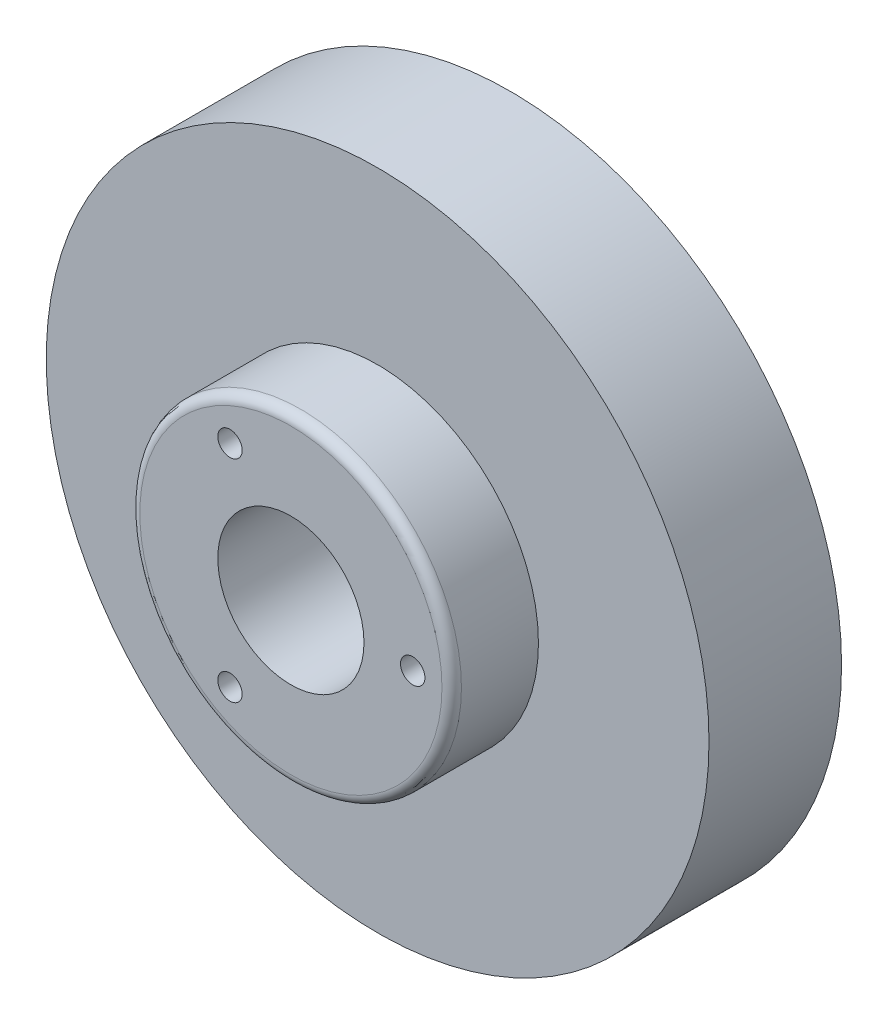
ISO-10303-21;
HEADER;
FILE_DESCRIPTION(('STEP AP214'),'2;1');
FILE_NAME('part.step','',(''),(''),'','','');
FILE_SCHEMA(('AUTOMOTIVE_DESIGN { 1 0 10303 214 1 1 1 1 }'));
ENDSEC;
DATA;
#1=APPLICATION_CONTEXT('core data for automotive mechanical design processes');
#2=APPLICATION_PROTOCOL_DEFINITION('international standard','automotive_design',2000,#1);
#3=PRODUCT_CONTEXT('',#1,'mechanical');
#4=PRODUCT('Part','Part','',(#3));
#5=PRODUCT_RELATED_PRODUCT_CATEGORY('part','',(#4));
#6=PRODUCT_DEFINITION_FORMATION('','',#4);
#7=PRODUCT_DEFINITION_CONTEXT('part definition',#1,'design');
#8=PRODUCT_DEFINITION('design','',#6,#7);
#9=PRODUCT_DEFINITION_SHAPE('','',#8);
#10=(LENGTH_UNIT() NAMED_UNIT(*) SI_UNIT(.MILLI.,.METRE.));
#11=(NAMED_UNIT(*) PLANE_ANGLE_UNIT() SI_UNIT($,.RADIAN.));
#12=(NAMED_UNIT(*) SI_UNIT($,.STERADIAN.) SOLID_ANGLE_UNIT());
#13=UNCERTAINTY_MEASURE_WITH_UNIT(LENGTH_MEASURE(1.E-05),#10,'distance_accuracy_value','');
#14=(GEOMETRIC_REPRESENTATION_CONTEXT(3) GLOBAL_UNCERTAINTY_ASSIGNED_CONTEXT((#13)) GLOBAL_UNIT_ASSIGNED_CONTEXT((#10,
#11,#12)) REPRESENTATION_CONTEXT('',''));
#15=CARTESIAN_POINT('',(0.,0.,0.));
#16=DIRECTION('',(0.,0.,1.));
#17=DIRECTION('',(1.,0.,0.));
#18=AXIS2_PLACEMENT_3D('',#15,#16,#17);
#19=CARTESIAN_POINT('',(0.,0.,13.6));
#20=DIRECTION('',(0.,0.,1.));
#21=DIRECTION('',(1.,0.,0.));
#22=AXIS2_PLACEMENT_3D('',#19,#20,#21);
#23=PLANE('',#22);
#24=CARTESIAN_POINT('',(0.,0.,13.6));
#25=DIRECTION('',(0.,0.,1.));
#26=DIRECTION('',(1.,0.,0.));
#27=AXIS2_PLACEMENT_3D('',#24,#25,#26);
#28=CIRCLE('',#27,34.);
#29=CARTESIAN_POINT('',(34.,0.,13.6));
#30=VERTEX_POINT('',#29);
#31=EDGE_CURVE('E46',#30,#30,#28,.T.);
#32=ORIENTED_EDGE('',*,*,#31,.T.);
#33=EDGE_LOOP('',(#32));
#34=FACE_BOUND('',#33,.T.);
#35=CARTESIAN_POINT('',(0.,0.,13.6));
#36=DIRECTION('',(0.,0.,1.));
#37=DIRECTION('',(1.,0.,0.));
#38=AXIS2_PLACEMENT_3D('',#35,#36,#37);
#39=CIRCLE('',#38,16.5);
#40=CARTESIAN_POINT('',(16.5,0.,13.6));
#41=VERTEX_POINT('',#40);
#42=EDGE_CURVE('E54',#41,#41,#39,.T.);
#43=ORIENTED_EDGE('',*,*,#42,.F.);
#44=EDGE_LOOP('',(#43));
#45=FACE_BOUND('',#44,.T.);
#46=ADVANCED_FACE('F35',(#34,#45),#23,.T.);
#47=CARTESIAN_POINT('',(0.,0.,13.6));
#48=DIRECTION('',(0.,0.,-1.));
#49=DIRECTION('',(-1.,0.,0.));
#50=AXIS2_PLACEMENT_3D('',#47,#48,#49);
#51=CYLINDRICAL_SURFACE('',#50,34.);
#52=ORIENTED_EDGE('',*,*,#31,.F.);
#53=EDGE_LOOP('',(#52));
#54=FACE_BOUND('',#53,.T.);
#55=CARTESIAN_POINT('',(0.,0.,0.));
#56=DIRECTION('',(0.,0.,1.));
#57=DIRECTION('',(1.,0.,0.));
#58=AXIS2_PLACEMENT_3D('',#55,#56,#57);
#59=CIRCLE('',#58,34.);
#60=CARTESIAN_POINT('',(34.,0.,0.));
#61=VERTEX_POINT('',#60);
#62=EDGE_CURVE('E50',#61,#61,#59,.T.);
#63=ORIENTED_EDGE('',*,*,#62,.T.);
#64=EDGE_LOOP('',(#63));
#65=FACE_BOUND('',#64,.T.);
#66=ADVANCED_FACE('F111',(#54,#65),#51,.T.);
#67=CARTESIAN_POINT('',(0.,0.,0.));
#68=DIRECTION('',(0.,0.,1.));
#69=DIRECTION('',(1.,0.,0.));
#70=AXIS2_PLACEMENT_3D('',#67,#68,#69);
#71=PLANE('',#70);
#72=CARTESIAN_POINT('',(-6.24999999999998,10.8253175473055,0.));
#73=DIRECTION('',(0.,0.,1.));
#74=DIRECTION('',(1.,0.,0.));
#75=AXIS2_PLACEMENT_3D('',#72,#73,#74);
#76=CIRCLE('',#75,1.25);
#77=CARTESIAN_POINT('',(-4.99999999999998,10.8253175473055,0.));
#78=VERTEX_POINT('',#77);
#79=EDGE_CURVE('E76',#78,#78,#76,.T.);
#80=ORIENTED_EDGE('',*,*,#79,.T.);
#81=EDGE_LOOP('',(#80));
#82=FACE_BOUND('',#81,.T.);
#83=CARTESIAN_POINT('',(-6.25000000000005,-10.8253175473055,0.));
#84=DIRECTION('',(0.,0.,1.));
#85=DIRECTION('',(1.,0.,0.));
#86=AXIS2_PLACEMENT_3D('',#83,#84,#85);
#87=CIRCLE('',#86,1.25);
#88=CARTESIAN_POINT('',(-5.00000000000006,-10.8253175473055,0.));
#89=VERTEX_POINT('',#88);
#90=EDGE_CURVE('E70',#89,#89,#87,.T.);
#91=ORIENTED_EDGE('',*,*,#90,.T.);
#92=EDGE_LOOP('',(#91));
#93=FACE_BOUND('',#92,.T.);
#94=CARTESIAN_POINT('',(12.5,0.,0.));
#95=DIRECTION('',(0.,0.,1.));
#96=DIRECTION('',(1.,0.,0.));
#97=AXIS2_PLACEMENT_3D('',#94,#95,#96);
#98=CIRCLE('',#97,1.25);
#99=CARTESIAN_POINT('',(13.75,0.,0.));
#100=VERTEX_POINT('',#99);
#101=EDGE_CURVE('E62',#100,#100,#98,.T.);
#102=ORIENTED_EDGE('',*,*,#101,.T.);
#103=EDGE_LOOP('',(#102));
#104=FACE_BOUND('',#103,.T.);
#105=CARTESIAN_POINT('',(0.,0.,0.));
#106=DIRECTION('',(0.,0.,1.));
#107=DIRECTION('',(1.,0.,0.));
#108=AXIS2_PLACEMENT_3D('',#105,#106,#107);
#109=CIRCLE('',#108,7.5);
#110=CARTESIAN_POINT('',(7.5,0.,0.));
#111=VERTEX_POINT('',#110);
#112=EDGE_CURVE('E58',#111,#111,#109,.T.);
#113=ORIENTED_EDGE('',*,*,#112,.T.);
#114=EDGE_LOOP('',(#113));
#115=FACE_BOUND('',#114,.T.);
#116=ORIENTED_EDGE('',*,*,#62,.F.);
#117=EDGE_LOOP('',(#116));
#118=FACE_BOUND('',#117,.T.);
#119=ADVANCED_FACE('F117',(#82,#93,#104,#115,#118),#71,.F.);
#120=CARTESIAN_POINT('',(0.,0.,22.5));
#121=DIRECTION('',(0.,0.,-1.));
#122=DIRECTION('',(-1.,0.,0.));
#123=AXIS2_PLACEMENT_3D('',#120,#121,#122);
#124=CYLINDRICAL_SURFACE('',#123,16.5);
#125=CARTESIAN_POINT('',(0.,0.,21.5));
#126=DIRECTION('',(0.,0.,1.));
#127=DIRECTION('',(1.,0.,0.));
#128=AXIS2_PLACEMENT_3D('',#125,#126,#127);
#129=CIRCLE('',#128,16.5);
#130=CARTESIAN_POINT('',(16.5,0.,21.5));
#131=VERTEX_POINT('',#130);
#132=EDGE_CURVE('E10',#131,#131,#129,.F.);
#133=ORIENTED_EDGE('',*,*,#132,.T.);
#134=EDGE_LOOP('',(#133));
#135=FACE_BOUND('',#134,.T.);
#136=ORIENTED_EDGE('',*,*,#42,.T.);
#137=EDGE_LOOP('',(#136));
#138=FACE_BOUND('',#137,.T.);
#139=ADVANCED_FACE('F88',(#135,#138),#124,.T.);
#140=CARTESIAN_POINT('',(0.,0.,22.5));
#141=DIRECTION('',(0.,0.,1.));
#142=DIRECTION('',(1.,0.,0.));
#143=AXIS2_PLACEMENT_3D('',#140,#141,#142);
#144=PLANE('',#143);
#145=CARTESIAN_POINT('',(-6.24999999999998,10.8253175473055,22.5));
#146=DIRECTION('',(0.,0.,1.));
#147=DIRECTION('',(1.,0.,0.));
#148=AXIS2_PLACEMENT_3D('',#145,#146,#147);
#149=CIRCLE('',#148,1.24999999999999);
#150=CARTESIAN_POINT('',(-4.99999999999999,10.8253175473055,22.5));
#151=VERTEX_POINT('',#150);
#152=EDGE_CURVE('E79',#151,#151,#149,.T.);
#153=ORIENTED_EDGE('',*,*,#152,.F.);
#154=EDGE_LOOP('',(#153));
#155=FACE_BOUND('',#154,.T.);
#156=CARTESIAN_POINT('',(-6.25000000000005,-10.8253175473055,22.5));
#157=DIRECTION('',(0.,0.,1.));
#158=DIRECTION('',(1.,0.,0.));
#159=AXIS2_PLACEMENT_3D('',#156,#157,#158);
#160=CIRCLE('',#159,1.24999999999999);
#161=CARTESIAN_POINT('',(-5.00000000000007,-10.8253175473055,22.5));
#162=VERTEX_POINT('',#161);
#163=EDGE_CURVE('E73',#162,#162,#160,.T.);
#164=ORIENTED_EDGE('',*,*,#163,.F.);
#165=EDGE_LOOP('',(#164));
#166=FACE_BOUND('',#165,.T.);
#167=CARTESIAN_POINT('',(12.5,0.,22.5));
#168=DIRECTION('',(0.,0.,1.));
#169=DIRECTION('',(1.,0.,0.));
#170=AXIS2_PLACEMENT_3D('',#167,#168,#169);
#171=CIRCLE('',#170,1.24999999999999);
#172=CARTESIAN_POINT('',(13.75,0.,22.5));
#173=VERTEX_POINT('',#172);
#174=EDGE_CURVE('E67',#173,#173,#171,.T.);
#175=ORIENTED_EDGE('',*,*,#174,.F.);
#176=EDGE_LOOP('',(#175));
#177=FACE_BOUND('',#176,.T.);
#178=CARTESIAN_POINT('',(0.,0.,22.5));
#179=DIRECTION('',(0.,0.,1.));
#180=DIRECTION('',(1.,0.,0.));
#181=AXIS2_PLACEMENT_3D('',#178,#179,#180);
#182=CIRCLE('',#181,7.5);
#183=CARTESIAN_POINT('',(7.5,0.,22.5));
#184=VERTEX_POINT('',#183);
#185=EDGE_CURVE('E59',#184,#184,#182,.T.);
#186=ORIENTED_EDGE('',*,*,#185,.F.);
#187=EDGE_LOOP('',(#186));
#188=FACE_BOUND('',#187,.T.);
#189=CARTESIAN_POINT('',(0.,0.,22.5));
#190=DIRECTION('',(0.,0.,1.));
#191=DIRECTION('',(1.,0.,0.));
#192=AXIS2_PLACEMENT_3D('',#189,#190,#191);
#193=CIRCLE('',#192,15.5);
#194=CARTESIAN_POINT('',(15.5,0.,22.5));
#195=VERTEX_POINT('',#194);
#196=EDGE_CURVE('E42',#195,#195,#193,.T.);
#197=ORIENTED_EDGE('',*,*,#196,.T.);
#198=EDGE_LOOP('',(#197));
#199=FACE_BOUND('',#198,.T.);
#200=ADVANCED_FACE('F85',(#155,#166,#177,#188,#199),#144,.T.);
#201=CARTESIAN_POINT('',(0.,0.,21.5));
#202=DIRECTION('',(0.,0.,1.));
#203=DIRECTION('',(1.,0.,0.));
#204=AXIS2_PLACEMENT_3D('',#201,#202,#203);
#205=TOROIDAL_SURFACE('',#204,15.5,1.);
#206=ORIENTED_EDGE('',*,*,#132,.F.);
#207=EDGE_LOOP('',(#206));
#208=FACE_BOUND('',#207,.T.);
#209=ORIENTED_EDGE('',*,*,#196,.F.);
#210=EDGE_LOOP('',(#209));
#211=FACE_BOUND('',#210,.T.);
#212=ADVANCED_FACE('F37',(#208,#211),#205,.T.);
#213=CARTESIAN_POINT('',(0.,0.,0.));
#214=DIRECTION('',(0.,0.,1.));
#215=DIRECTION('',(1.,0.,0.));
#216=AXIS2_PLACEMENT_3D('',#213,#214,#215);
#217=CYLINDRICAL_SURFACE('',#216,7.5);
#218=CARTESIAN_POINT('',(7.5,0.,0.));
#219=CARTESIAN_POINT('',(7.5,0.,0.234374999999999));
#220=CARTESIAN_POINT('',(7.5,0.,0.46875));
#221=CARTESIAN_POINT('',(7.5,0.,0.9375));
#222=CARTESIAN_POINT('',(7.5,0.,1.171875));
#223=CARTESIAN_POINT('',(7.5,0.,1.640625));
#224=CARTESIAN_POINT('',(7.5,0.,1.875));
#225=CARTESIAN_POINT('',(7.5,0.,2.34375));
#226=CARTESIAN_POINT('',(7.5,0.,2.578125));
#227=CARTESIAN_POINT('',(7.5,0.,3.046875));
#228=CARTESIAN_POINT('',(7.5,0.,3.28125));
#229=CARTESIAN_POINT('',(7.5,0.,3.75));
#230=CARTESIAN_POINT('',(7.5,0.,3.984375));
#231=CARTESIAN_POINT('',(7.5,0.,4.453125));
#232=CARTESIAN_POINT('',(7.5,0.,4.6875));
#233=CARTESIAN_POINT('',(7.5,0.,5.15625));
#234=CARTESIAN_POINT('',(7.5,0.,5.390625));
#235=CARTESIAN_POINT('',(7.5,0.,5.859375));
#236=CARTESIAN_POINT('',(7.5,0.,6.09375));
#237=CARTESIAN_POINT('',(7.5,0.,6.5625));
#238=CARTESIAN_POINT('',(7.5,0.,6.796875));
#239=CARTESIAN_POINT('',(7.5,0.,7.265625));
#240=CARTESIAN_POINT('',(7.5,0.,7.5));
#241=CARTESIAN_POINT('',(7.5,0.,7.96875));
#242=CARTESIAN_POINT('',(7.5,0.,8.203125));
#243=CARTESIAN_POINT('',(7.5,0.,8.671875));
#244=CARTESIAN_POINT('',(7.5,0.,8.90625));
#245=CARTESIAN_POINT('',(7.5,0.,9.375));
#246=CARTESIAN_POINT('',(7.5,0.,9.609375));
#247=CARTESIAN_POINT('',(7.5,0.,10.078125));
#248=CARTESIAN_POINT('',(7.5,0.,10.3125));
#249=CARTESIAN_POINT('',(7.5,0.,10.78125));
#250=CARTESIAN_POINT('',(7.5,0.,11.015625));
#251=CARTESIAN_POINT('',(7.5,0.,11.484375));
#252=CARTESIAN_POINT('',(7.5,0.,11.71875));
#253=CARTESIAN_POINT('',(7.5,0.,12.1875));
#254=CARTESIAN_POINT('',(7.5,0.,12.421875));
#255=CARTESIAN_POINT('',(7.5,0.,12.890625));
#256=CARTESIAN_POINT('',(7.5,0.,13.125));
#257=CARTESIAN_POINT('',(7.5,0.,13.59375));
#258=CARTESIAN_POINT('',(7.5,0.,13.828125));
#259=CARTESIAN_POINT('',(7.5,0.,14.296875));
#260=CARTESIAN_POINT('',(7.5,0.,14.53125));
#261=CARTESIAN_POINT('',(7.5,0.,15.));
#262=CARTESIAN_POINT('',(7.5,0.,15.234375));
#263=CARTESIAN_POINT('',(7.5,0.,15.703125));
#264=CARTESIAN_POINT('',(7.5,0.,15.9375));
#265=CARTESIAN_POINT('',(7.5,0.,16.40625));
#266=CARTESIAN_POINT('',(7.5,0.,16.640625));
#267=CARTESIAN_POINT('',(7.5,0.,17.109375));
#268=CARTESIAN_POINT('',(7.5,0.,17.34375));
#269=CARTESIAN_POINT('',(7.5,0.,17.8125));
#270=CARTESIAN_POINT('',(7.5,0.,18.046875));
#271=CARTESIAN_POINT('',(7.5,0.,18.515625));
#272=CARTESIAN_POINT('',(7.5,0.,18.75));
#273=CARTESIAN_POINT('',(7.5,0.,19.21875));
#274=CARTESIAN_POINT('',(7.5,0.,19.453125));
#275=CARTESIAN_POINT('',(7.5,0.,19.921875));
#276=CARTESIAN_POINT('',(7.5,0.,20.15625));
#277=CARTESIAN_POINT('',(7.5,0.,20.625));
#278=CARTESIAN_POINT('',(7.5,0.,20.859375));
#279=CARTESIAN_POINT('',(7.5,0.,21.328125));
#280=CARTESIAN_POINT('',(7.5,0.,21.5625));
#281=CARTESIAN_POINT('',(7.5,0.,22.03125));
#282=CARTESIAN_POINT('',(7.5,0.,22.265625));
#283=CARTESIAN_POINT('',(7.5,0.,22.5));
#284=B_SPLINE_CURVE_WITH_KNOTS('',3,(#218,#219,#220,#221,#222,#223,#224,#225,#226,#227,#228,
#229,#230,#231,#232,#233,#234,#235,#236,#237,#238,#239,#240,#241,#242,#243,#244,#245,#246,#247,
#248,#249,#250,#251,#252,#253,#254,#255,#256,#257,#258,#259,#260,#261,#262,#263,#264,#265,#266,
#267,#268,#269,#270,#271,#272,#273,#274,#275,#276,#277,#278,#279,#280,#281,#282,#283),
.UNSPECIFIED.,.F.,.F.,(4,2,2,2,2,2,2,2,2,2,2,2,2,2,2,2,2,2,2,2,2,2,2,2,2,2,2,2,2,2,2,2,4),(0.,
0.703125,1.40625,2.109375,2.8125,3.515625,4.21875,4.921875,5.625,6.328125,7.03125,7.734375,
8.4375,9.140625,9.84375,10.546875,11.25,11.953125,12.65625,13.359375,14.0625,14.765625,15.46875,
16.171875,16.875,17.578125,18.28125,18.984375,19.6875,20.390625,21.09375,21.796875,22.5),.UNSPECIFIED.);
#285=EDGE_CURVE('BSEAM96',#111,#184,#284,.T.);
#286=ORIENTED_EDGE('',*,*,#112,.F.);
#287=ORIENTED_EDGE('',*,*,#185,.T.);
#288=ORIENTED_EDGE('',*,*,#285,.T.);
#289=ORIENTED_EDGE('',*,*,#285,.F.);
#290=EDGE_LOOP('',(#286,#288,#287,#289));
#291=FACE_BOUND('',#290,.T.);
#292=ADVANCED_FACE('F96',(#291),#217,.F.);
#293=CARTESIAN_POINT('',(12.5,0.,22.5));
#294=DIRECTION('',(0.,0.,1.));
#295=DIRECTION('',(1.,0.,0.));
#296=AXIS2_PLACEMENT_3D('',#293,#294,#295);
#297=CYLINDRICAL_SURFACE('',#296,1.24999999999999);
#298=ORIENTED_EDGE('',*,*,#101,.F.);
#299=EDGE_LOOP('',(#298));
#300=FACE_BOUND('',#299,.T.);
#301=ORIENTED_EDGE('',*,*,#174,.T.);
#302=EDGE_LOOP('',(#301));
#303=FACE_BOUND('',#302,.T.);
#304=ADVANCED_FACE('F98',(#300,#303),#297,.F.);
#305=CARTESIAN_POINT('',(-6.25000000000005,-10.8253175473055,22.5));
#306=DIRECTION('',(0.,0.,1.));
#307=DIRECTION('',(1.,0.,0.));
#308=AXIS2_PLACEMENT_3D('',#305,#306,#307);
#309=CYLINDRICAL_SURFACE('',#308,1.24999999999999);
#310=ORIENTED_EDGE('',*,*,#90,.F.);
#311=EDGE_LOOP('',(#310));
#312=FACE_BOUND('',#311,.T.);
#313=ORIENTED_EDGE('',*,*,#163,.T.);
#314=EDGE_LOOP('',(#313));
#315=FACE_BOUND('',#314,.T.);
#316=ADVANCED_FACE('F105',(#312,#315),#309,.F.);
#317=CARTESIAN_POINT('',(-6.24999999999998,10.8253175473055,22.5));
#318=DIRECTION('',(0.,0.,1.));
#319=DIRECTION('',(1.,0.,0.));
#320=AXIS2_PLACEMENT_3D('',#317,#318,#319);
#321=CYLINDRICAL_SURFACE('',#320,1.24999999999999);
#322=ORIENTED_EDGE('',*,*,#79,.F.);
#323=EDGE_LOOP('',(#322));
#324=FACE_BOUND('',#323,.T.);
#325=ORIENTED_EDGE('',*,*,#152,.T.);
#326=EDGE_LOOP('',(#325));
#327=FACE_BOUND('',#326,.T.);
#328=ADVANCED_FACE('F83',(#324,#327),#321,.F.);
#329=CLOSED_SHELL('',(#46,#66,#119,#139,#200,#212,#292,#304,#316,#328));
#330=MANIFOLD_SOLID_BREP('B2',#329);
#331=ADVANCED_BREP_SHAPE_REPRESENTATION('',(#18,#330),#14);
#332=SHAPE_DEFINITION_REPRESENTATION(#9,#331);
ENDSEC;
END-ISO-10303-21;
